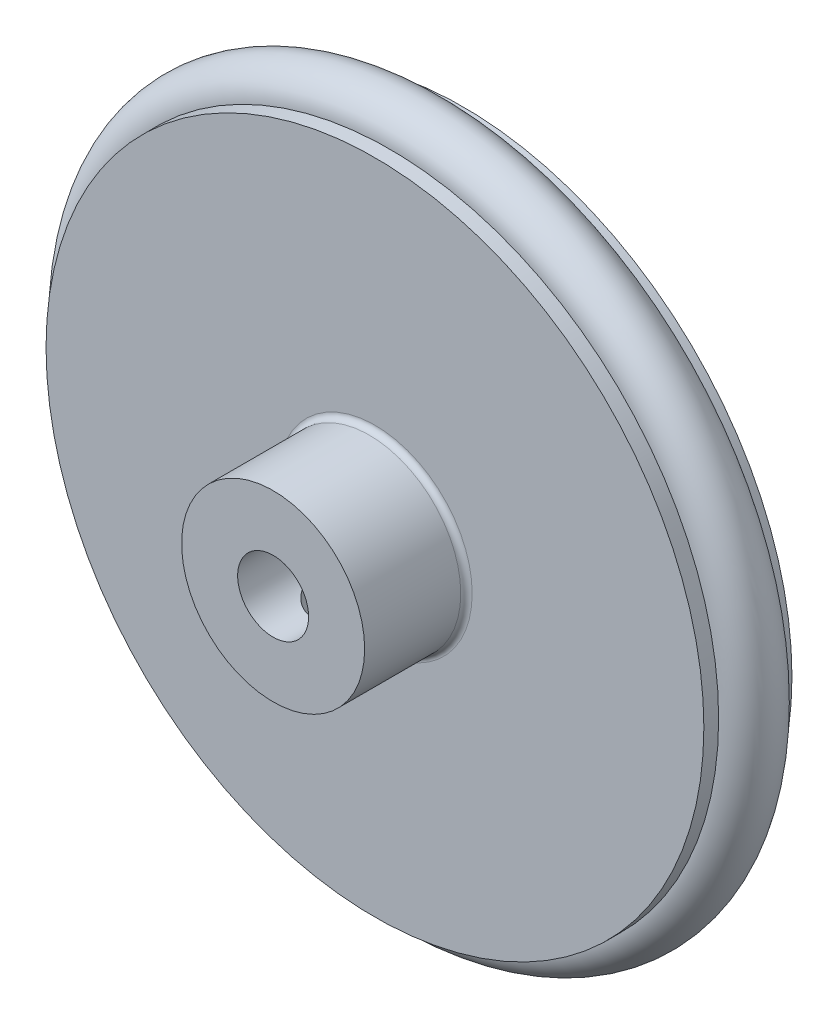
ISO-10303-21;
HEADER;
FILE_DESCRIPTION(('STEP AP214'),'2;1');
FILE_NAME('part.step','',(''),(''),'','','');
FILE_SCHEMA(('AUTOMOTIVE_DESIGN { 1 0 10303 214 1 1 1 1 }'));
ENDSEC;
DATA;
#1=APPLICATION_CONTEXT('core data for automotive mechanical design processes');
#2=APPLICATION_PROTOCOL_DEFINITION('international standard','automotive_design',2000,#1);
#3=PRODUCT_CONTEXT('',#1,'mechanical');
#4=PRODUCT('Part','Part','',(#3));
#5=PRODUCT_RELATED_PRODUCT_CATEGORY('part','',(#4));
#6=PRODUCT_DEFINITION_FORMATION('','',#4);
#7=PRODUCT_DEFINITION_CONTEXT('part definition',#1,'design');
#8=PRODUCT_DEFINITION('design','',#6,#7);
#9=PRODUCT_DEFINITION_SHAPE('','',#8);
#10=(LENGTH_UNIT() NAMED_UNIT(*) SI_UNIT(.MILLI.,.METRE.));
#11=(NAMED_UNIT(*) PLANE_ANGLE_UNIT() SI_UNIT($,.RADIAN.));
#12=(NAMED_UNIT(*) SI_UNIT($,.STERADIAN.) SOLID_ANGLE_UNIT());
#13=UNCERTAINTY_MEASURE_WITH_UNIT(LENGTH_MEASURE(1.E-05),#10,'distance_accuracy_value','');
#14=(GEOMETRIC_REPRESENTATION_CONTEXT(3) GLOBAL_UNCERTAINTY_ASSIGNED_CONTEXT((#13)) GLOBAL_UNIT_ASSIGNED_CONTEXT((#10,
#11,#12)) REPRESENTATION_CONTEXT('',''));
#15=CARTESIAN_POINT('',(0.,0.,0.));
#16=DIRECTION('',(0.,0.,1.));
#17=DIRECTION('',(1.,0.,0.));
#18=AXIS2_PLACEMENT_3D('',#15,#16,#17);
#19=CARTESIAN_POINT('',(0.,0.,0.));
#20=DIRECTION('',(0.,0.,-1.));
#21=DIRECTION('',(-1.,0.,0.));
#22=AXIS2_PLACEMENT_3D('',#19,#20,#21);
#23=TOROIDAL_SURFACE('',#22,28.75,2.56123692555145);
#24=CARTESIAN_POINT('',(28.75,0.,0.));
#25=DIRECTION('',(0.,1.,0.));
#26=DIRECTION('',(0.,0.,1.));
#27=AXIS2_PLACEMENT_3D('',#24,#25,#26);
#28=CIRCLE('',#27,2.56123692555145);
#29=CARTESIAN_POINT('',(31.3112369255514,0.,0.));
#30=VERTEX_POINT('',#29);
#31=EDGE_CURVE('E11',#30,#30,#28,.T.);
#32=CARTESIAN_POINT('',(0.,0.,0.));
#33=DIRECTION('',(0.,0.,-1.));
#34=DIRECTION('',(-1.,0.,0.));
#35=AXIS2_PLACEMENT_3D('',#32,#33,#34);
#36=CIRCLE('',#35,31.3112369255515);
#37=EDGE_CURVE('',#30,#30,#36,.T.);
#38=ORIENTED_EDGE('',*,*,#31,.F.);
#39=ORIENTED_EDGE('',*,*,#31,.T.);
#40=ORIENTED_EDGE('',*,*,#37,.T.);
#41=ORIENTED_EDGE('',*,*,#37,.F.);
#42=EDGE_LOOP('',(#38,#40,#39,#41));
#43=FACE_BOUND('',#42,.T.);
#44=ADVANCED_FACE('F46',(#43),#23,.T.);
#45=CLOSED_SHELL('',(#44));
#46=MANIFOLD_SOLID_BREP('B2',#45);
#47=CARTESIAN_POINT('',(0.,0.,3.85));
#48=DIRECTION('',(0.,0.,-1.));
#49=DIRECTION('',(-1.,0.,0.));
#50=AXIS2_PLACEMENT_3D('',#47,#48,#49);
#51=CYLINDRICAL_SURFACE('',#50,28.75);
#52=CARTESIAN_POINT('',(0.,0.,2.55));
#53=DIRECTION('',(0.,0.,-1.));
#54=DIRECTION('',(-1.,0.,0.));
#55=AXIS2_PLACEMENT_3D('',#52,#53,#54);
#56=CIRCLE('',#55,28.75);
#57=CARTESIAN_POINT('',(28.75,0.,2.55));
#58=VERTEX_POINT('',#57);
#59=EDGE_CURVE('E86',#58,#58,#56,.F.);
#60=ORIENTED_EDGE('',*,*,#59,.T.);
#61=EDGE_LOOP('',(#60));
#62=FACE_BOUND('',#61,.T.);
#63=CARTESIAN_POINT('',(0.,0.,3.85));
#64=DIRECTION('',(0.,0.,1.));
#65=DIRECTION('',(1.,0.,0.));
#66=AXIS2_PLACEMENT_3D('',#63,#64,#65);
#67=CIRCLE('',#66,28.75);
#68=CARTESIAN_POINT('',(28.75,0.,3.85));
#69=VERTEX_POINT('',#68);
#70=EDGE_CURVE('E91',#69,#69,#67,.T.);
#71=ORIENTED_EDGE('',*,*,#70,.F.);
#72=EDGE_LOOP('',(#71));
#73=FACE_BOUND('',#72,.T.);
#74=ADVANCED_FACE('F66',(#62,#73),#51,.T.);
#75=CARTESIAN_POINT('',(0.,0.,3.85));
#76=DIRECTION('',(0.,0.,1.));
#77=DIRECTION('',(1.,0.,0.));
#78=AXIS2_PLACEMENT_3D('',#75,#76,#77);
#79=PLANE('',#78);
#80=CARTESIAN_POINT('',(0.,0.,3.85));
#81=DIRECTION('',(0.,0.,1.));
#82=DIRECTION('',(1.,0.,0.));
#83=AXIS2_PLACEMENT_3D('',#80,#81,#82);
#84=CIRCLE('',#83,8.5);
#85=CARTESIAN_POINT('',(8.5,0.,3.85));
#86=VERTEX_POINT('',#85);
#87=EDGE_CURVE('E44',#86,#86,#84,.F.);
#88=ORIENTED_EDGE('',*,*,#87,.T.);
#89=EDGE_LOOP('',(#88));
#90=FACE_BOUND('',#89,.T.);
#91=ORIENTED_EDGE('',*,*,#70,.T.);
#92=EDGE_LOOP('',(#91));
#93=FACE_BOUND('',#92,.T.);
#94=ADVANCED_FACE('F138',(#90,#93),#79,.T.);
#95=CARTESIAN_POINT('',(0.,0.,0.));
#96=DIRECTION('',(0.,0.,1.));
#97=DIRECTION('',(1.,0.,0.));
#98=AXIS2_PLACEMENT_3D('',#95,#96,#97);
#99=TOROIDAL_SURFACE('',#98,28.75,2.55);
#100=CARTESIAN_POINT('',(28.75,0.,0.));
#101=DIRECTION('',(0.,1.,0.));
#102=DIRECTION('',(0.,0.,1.));
#103=AXIS2_PLACEMENT_3D('',#100,#101,#102);
#104=CIRCLE('',#103,2.55);
#105=CARTESIAN_POINT('',(28.75,0.,-2.55));
#106=VERTEX_POINT('',#105);
#107=EDGE_CURVE('E81',#106,#58,#104,.T.);
#108=ORIENTED_EDGE('',*,*,#107,.F.);
#109=CARTESIAN_POINT('',(0.,0.,-2.55));
#110=DIRECTION('',(0.,0.,1.));
#111=DIRECTION('',(1.,0.,0.));
#112=AXIS2_PLACEMENT_3D('',#109,#110,#111);
#113=CIRCLE('',#112,28.75);
#114=EDGE_CURVE('E84',#106,#106,#113,.F.);
#115=ORIENTED_EDGE('',*,*,#114,.F.);
#116=ORIENTED_EDGE('',*,*,#107,.T.);
#117=ORIENTED_EDGE('',*,*,#59,.F.);
#118=EDGE_LOOP('',(#108,#115,#116,#117));
#119=FACE_BOUND('',#118,.T.);
#120=ADVANCED_FACE('F82',(#119),#99,.F.);
#121=CARTESIAN_POINT('',(0.,0.,-3.85));
#122=DIRECTION('',(0.,0.,1.));
#123=DIRECTION('',(1.,0.,0.));
#124=AXIS2_PLACEMENT_3D('',#121,#122,#123);
#125=PLANE('',#124);
#126=CARTESIAN_POINT('',(0.,0.,-3.85));
#127=DIRECTION('',(0.,0.,1.));
#128=DIRECTION('',(1.,0.,0.));
#129=AXIS2_PLACEMENT_3D('',#126,#127,#128);
#130=CIRCLE('',#129,28.75);
#131=CARTESIAN_POINT('',(28.75,0.,-3.85));
#132=VERTEX_POINT('',#131);
#133=EDGE_CURVE('E87',#132,#132,#130,.T.);
#134=ORIENTED_EDGE('',*,*,#133,.F.);
#135=EDGE_LOOP('',(#134));
#136=FACE_BOUND('',#135,.T.);
#137=ADVANCED_FACE('F137',(#136),#125,.F.);
#138=ORIENTED_EDGE('',*,*,#114,.T.);
#139=EDGE_LOOP('',(#138));
#140=FACE_BOUND('',#139,.T.);
#141=ORIENTED_EDGE('',*,*,#133,.T.);
#142=EDGE_LOOP('',(#141));
#143=FACE_BOUND('',#142,.T.);
#144=ADVANCED_FACE('F133',(#140,#143),#51,.T.);
#145=CARTESIAN_POINT('',(0.,0.,12.75));
#146=DIRECTION('',(0.,0.,-1.));
#147=DIRECTION('',(-1.,0.,0.));
#148=AXIS2_PLACEMENT_3D('',#145,#146,#147);
#149=CYLINDRICAL_SURFACE('',#148,8.);
#150=CARTESIAN_POINT('',(0.,0.,4.35));
#151=DIRECTION('',(0.,0.,1.));
#152=DIRECTION('',(1.,0.,0.));
#153=AXIS2_PLACEMENT_3D('',#150,#151,#152);
#154=CIRCLE('',#153,8.);
#155=CARTESIAN_POINT('',(8.,0.,4.35));
#156=VERTEX_POINT('',#155);
#157=EDGE_CURVE('E74',#156,#156,#154,.T.);
#158=ORIENTED_EDGE('',*,*,#157,.T.);
#159=EDGE_LOOP('',(#158));
#160=FACE_BOUND('',#159,.T.);
#161=CARTESIAN_POINT('',(0.,-8.,9.5));
#162=CARTESIAN_POINT('',(0.110501451559641,-7.9999981315735,9.49999689901579));
#163=CARTESIAN_POINT('',(0.221037543774351,-7.99768770842435,9.49081126563495));
#164=CARTESIAN_POINT('',(0.438941765027377,-7.98869485106526,9.45436646492399));
#165=CARTESIAN_POINT('',(0.546308062494319,-7.98200993893301,9.42709705394953));
#166=CARTESIAN_POINT('',(0.754694496243435,-7.96500835109376,9.35541432871722));
#167=CARTESIAN_POINT('',(0.855722084573336,-7.95469603789411,9.31102160171297));
#168=CARTESIAN_POINT('',(1.04889617587257,-7.93153791743495,9.20642481327354));
#169=CARTESIAN_POINT('',(1.14104237913168,-7.91869202472209,9.14622021850805));
#170=CARTESIAN_POINT('',(1.31573590306789,-7.89156551455591,9.01039894712776));
#171=CARTESIAN_POINT('',(1.39807425341474,-7.87726276197502,8.93451790005459));
#172=CARTESIAN_POINT('',(1.54899856960443,-7.84898160157248,8.77006372678795));
#173=CARTESIAN_POINT('',(1.61758298259892,-7.83500323053157,8.68148916940408));
#174=CARTESIAN_POINT('',(1.74003539039863,-7.80873034264225,8.49253969768401));
#175=CARTESIAN_POINT('',(1.79366962123352,-7.79646392619748,8.39200902558836));
#176=CARTESIAN_POINT('',(1.88319587806766,-7.77532659757355,8.18300211778662));
#177=CARTESIAN_POINT('',(1.91909074058685,-7.76645514259225,8.07452715555731));
#178=CARTESIAN_POINT('',(1.97140644907302,-7.7533396892843,7.85500866906446));
#179=CARTESIAN_POINT('',(1.98820302444274,-7.74900654662681,7.74406013861601));
#180=CARTESIAN_POINT('',(2.00301570008854,-7.74519149946122,7.52084190800087));
#181=CARTESIAN_POINT('',(2.00103485575748,-7.74570880570571,7.40857242574382));
#182=CARTESIAN_POINT('',(1.97864869951961,-7.75145607355756,7.1887789230062));
#183=CARTESIAN_POINT('',(1.95869112025418,-7.75657150676391,7.08120583804623));
#184=CARTESIAN_POINT('',(1.90163224920399,-7.77075612894758,6.87098526545192));
#185=CARTESIAN_POINT('',(1.86452973609252,-7.77982559958985,6.76833812929477));
#186=CARTESIAN_POINT('',(1.77385263724958,-7.80100151874212,6.56968264499716));
#187=CARTESIAN_POINT('',(1.72011555631056,-7.81313769959755,6.47375177094724));
#188=CARTESIAN_POINT('',(1.59780836801993,-7.83906281127988,6.29210838699091));
#189=CARTESIAN_POINT('',(1.52923566507845,-7.85285203112837,6.20639766924367));
#190=CARTESIAN_POINT('',(1.37688456624163,-7.88101174053188,6.04506184574079));
#191=CARTESIAN_POINT('',(1.29272834422115,-7.89538759304001,5.96979401325153));
#192=CARTESIAN_POINT('',(1.11281589000493,-7.92274620771675,5.8343716767148));
#193=CARTESIAN_POINT('',(1.01705930361059,-7.93572892732543,5.77421763431525));
#194=CARTESIAN_POINT('',(0.816154518241855,-7.9589030945892,5.67059921836749));
#195=CARTESIAN_POINT('',(0.710975190944831,-7.96908480170303,5.62719287966076));
#196=CARTESIAN_POINT('',(0.49450134419051,-7.98543889321888,5.55877692572057));
#197=CARTESIAN_POINT('',(0.383207998867312,-7.99161204452374,5.53376379144248));
#198=CARTESIAN_POINT('',(0.160719960520035,-7.999139990285,5.50338991258822));
#199=CARTESIAN_POINT('',(0.0495956266509452,-8.00061404677705,5.4975426318996));
#200=CARTESIAN_POINT('',(-0.172043833068678,-7.99891739752601,5.50433200274065));
#201=CARTESIAN_POINT('',(-0.282559012859461,-7.99574710989128,5.51696699039884));
#202=CARTESIAN_POINT('',(-0.498152358368656,-7.98519441503143,5.55996121118851));
#203=CARTESIAN_POINT('',(-0.603286825291673,-7.97787512247748,5.59005501796932));
#204=CARTESIAN_POINT('',(-0.807009723270016,-7.95984942178845,5.66680944537126));
#205=CARTESIAN_POINT('',(-0.905597492043513,-7.94914267159856,5.71347173908423));
#206=CARTESIAN_POINT('',(-1.0953641792398,-7.92524410568414,5.82298150516631));
#207=CARTESIAN_POINT('',(-1.18638058911444,-7.91201156489243,5.88610148319569));
#208=CARTESIAN_POINT('',(-1.35670215152433,-7.88459345583226,6.02638654506263));
#209=CARTESIAN_POINT('',(-1.43600527863068,-7.87040772335606,6.10355405282254));
#210=CARTESIAN_POINT('',(-1.58265409076364,-7.84225275947695,6.27200261445929));
#211=CARTESIAN_POINT('',(-1.64965849016271,-7.82829738916375,6.36358360400323));
#212=CARTESIAN_POINT('',(-1.7673476786836,-7.80257171169652,6.55697684595429));
#213=CARTESIAN_POINT('',(-1.81803319221058,-7.79080130756035,6.65878864394634));
#214=CARTESIAN_POINT('',(-1.90126856081239,-7.77090792979553,6.86920762988411));
#215=CARTESIAN_POINT('',(-1.93392586220542,-7.76276340389207,6.97777017112535));
#216=CARTESIAN_POINT('',(-1.98046087993837,-7.75102325453578,7.19907951718548));
#217=CARTESIAN_POINT('',(-1.99434270330488,-7.74742663626581,7.31182540137666));
#218=CARTESIAN_POINT('',(-2.00271812044533,-7.74526534938609,7.53482803180694));
#219=CARTESIAN_POINT('',(-1.99775719704016,-7.74655910304352,7.64506324683298));
#220=CARTESIAN_POINT('',(-1.96983637108382,-7.7537054534379,7.86307185155731));
#221=CARTESIAN_POINT('',(-1.94687683024903,-7.75955795855809,7.97084529068487));
#222=CARTESIAN_POINT('',(-1.88390842592373,-7.77508347576963,8.18027794542055));
#223=CARTESIAN_POINT('',(-1.84400187290717,-7.78473353648412,8.28196974032028));
#224=CARTESIAN_POINT('',(-1.74835321814009,-7.80677007633105,8.47728717695159));
#225=CARTESIAN_POINT('',(-1.69260892004558,-7.81915693494364,8.57091169758256));
#226=CARTESIAN_POINT('',(-1.56515699818285,-7.8456751235135,8.75007283866936));
#227=CARTESIAN_POINT('',(-1.493070883883,-7.85984353109009,8.83533476456528));
#228=CARTESIAN_POINT('',(-1.33571916158631,-7.88810702995048,8.99272939306054));
#229=CARTESIAN_POINT('',(-1.25045042834819,-7.90220210302746,9.06485897348396));
#230=CARTESIAN_POINT('',(-1.06729011560345,-7.92903540863551,9.19521507808614));
#231=CARTESIAN_POINT('',(-0.969197896421848,-7.94174444487824,9.25316615156211));
#232=CARTESIAN_POINT('',(-0.764354746013967,-7.96406566633491,9.35166328392071));
#233=CARTESIAN_POINT('',(-0.657610084582319,-7.97368006933042,9.39222181419805));
#234=CARTESIAN_POINT('',(-0.459213670991295,-7.98730746087389,9.44876244043954));
#235=CARTESIAN_POINT('',(-0.368506894544092,-7.9920344673692,9.46793499073791));
#236=CARTESIAN_POINT('',(-0.185208095381711,-7.99838140309264,9.49355459149592));
#237=CARTESIAN_POINT('',(-0.0926162149901552,-8.00000156601192,9.50000259907373));
#238=CARTESIAN_POINT('',(0.,-8.,9.5));
#239=B_SPLINE_CURVE_WITH_KNOTS('',3,(#161,#162,#163,#164,#165,#166,#167,#168,#169,#170,#171,
#172,#173,#174,#175,#176,#177,#178,#179,#180,#181,#182,#183,#184,#185,#186,#187,#188,#189,#190,
#191,#192,#193,#194,#195,#196,#197,#198,#199,#200,#201,#202,#203,#204,#205,#206,#207,#208,#209,
#210,#211,#212,#213,#214,#215,#216,#217,#218,#219,#220,#221,#222,#223,#224,#225,#226,#227,#228,
#229,#230,#231,#232,#233,#234,#235,#236,#237,#238),.UNSPECIFIED.,.T.,.F.,(4,2,2,2,2,2,2,2,2,2,2,
2,2,2,2,2,2,2,2,2,2,2,2,2,2,2,2,2,2,2,2,2,2,2,2,2,2,2,4),(0.,0.331164949962519,
0.662517650351866,0.993473203048141,1.32443992022577,1.66152580582852,1.99864972773416,
2.34078196727742,2.68285948225824,3.01808393468093,3.3532538415469,3.68029996013785,
4.00736937959146,4.337740371696,4.66816921119311,5.00802001296453,5.34788119415424,
5.6889097201658,6.02987298255951,6.36211078603463,6.69431868154752,7.02160366023144,
7.34892169767482,7.68204783424897,8.01523150681786,8.35659345610396,8.69794025003772,
9.03723006156476,9.37644564340971,9.70591707202578,10.0353818794581,10.3628853408369,
10.6904342418696,11.0265276855097,11.3627009303165,11.7049624733721,12.0469781843289,
12.3245632392729,12.6021274139515),.UNSPECIFIED.);
#240=CARTESIAN_POINT('',(0.,-8.,9.5));
#241=VERTEX_POINT('',#240);
#242=EDGE_CURVE('E109',#241,#241,#239,.T.);
#243=ORIENTED_EDGE('',*,*,#242,.T.);
#244=EDGE_LOOP('',(#243));
#245=FACE_BOUND('',#244,.T.);
#246=CARTESIAN_POINT('',(0.,0.,12.75));
#247=DIRECTION('',(0.,0.,1.));
#248=DIRECTION('',(1.,0.,0.));
#249=AXIS2_PLACEMENT_3D('',#246,#247,#248);
#250=CIRCLE('',#249,8.);
#251=CARTESIAN_POINT('',(8.,0.,12.75));
#252=VERTEX_POINT('',#251);
#253=EDGE_CURVE('E88',#252,#252,#250,.T.);
#254=ORIENTED_EDGE('',*,*,#253,.F.);
#255=EDGE_LOOP('',(#254));
#256=FACE_BOUND('',#255,.T.);
#257=ADVANCED_FACE('F128',(#160,#245,#256),#149,.T.);
#258=CARTESIAN_POINT('',(0.,0.,12.75));
#259=DIRECTION('',(0.,0.,1.));
#260=DIRECTION('',(1.,0.,0.));
#261=AXIS2_PLACEMENT_3D('',#258,#259,#260);
#262=PLANE('',#261);
#263=CARTESIAN_POINT('',(0.,0.,12.75));
#264=DIRECTION('',(0.,0.,1.));
#265=DIRECTION('',(1.,0.,0.));
#266=AXIS2_PLACEMENT_3D('',#263,#264,#265);
#267=CIRCLE('',#266,3.1);
#268=CARTESIAN_POINT('',(3.1,0.,12.75));
#269=VERTEX_POINT('',#268);
#270=EDGE_CURVE('E127',#269,#269,#267,.T.);
#271=ORIENTED_EDGE('',*,*,#270,.F.);
#272=EDGE_LOOP('',(#271));
#273=FACE_BOUND('',#272,.T.);
#274=ORIENTED_EDGE('',*,*,#253,.T.);
#275=EDGE_LOOP('',(#274));
#276=FACE_BOUND('',#275,.T.);
#277=ADVANCED_FACE('F132',(#273,#276),#262,.T.);
#278=CARTESIAN_POINT('',(0.,0.,-12.6181240867132));
#279=DIRECTION('',(0.,0.,1.));
#280=DIRECTION('',(1.,0.,0.));
#281=AXIS2_PLACEMENT_3D('',#278,#279,#280);
#282=CYLINDRICAL_SURFACE('',#281,3.1);
#283=CARTESIAN_POINT('',(0.,-3.1,9.5));
#284=CARTESIAN_POINT('',(-0.101091385039777,-3.09999460939274,9.49999423985456));
#285=CARTESIAN_POINT('',(-0.202236134564494,-3.09500777365122,9.49228861003426));
#286=CARTESIAN_POINT('',(-0.40134422219677,-3.07554251080367,9.46191052513201));
#287=CARTESIAN_POINT('',(-0.499304337672782,-3.0610547651011,9.43922337585951));
#288=CARTESIAN_POINT('',(-0.688847609969658,-3.02403316266577,9.38023929755381));
#289=CARTESIAN_POINT('',(-0.780458562332545,-3.00153742435718,9.34400680467486));
#290=CARTESIAN_POINT('',(-0.955964244967446,-2.95033924070804,9.25944096599089));
#291=CARTESIAN_POINT('',(-1.03985843062382,-2.9216363577727,9.21110676699504));
#292=CARTESIAN_POINT('',(-1.20534975085783,-2.85755815418126,9.09934687867213));
#293=CARTESIAN_POINT('',(-1.28618869122808,-2.82182799524603,9.0350061395549));
#294=CARTESIAN_POINT('',(-1.43665631544782,-2.74828108070154,8.89520120954714));
#295=CARTESIAN_POINT('',(-1.50626924383573,-2.71046149080006,8.81972166508535));
#296=CARTESIAN_POINT('',(-1.64268679943019,-2.63034253686168,8.64691651791072));
#297=CARTESIAN_POINT('',(-1.70759476074744,-2.58819607847858,8.54801033709484));
#298=CARTESIAN_POINT('',(-1.81972592440112,-2.51062817225813,8.33825819113032));
#299=CARTESIAN_POINT('',(-1.86697956402236,-2.47519520238284,8.2274332037925));
#300=CARTESIAN_POINT('',(-1.93115046035712,-2.42525032881529,8.02768249145855));
#301=CARTESIAN_POINT('',(-1.95283049983355,-2.40766682164749,7.94106125555081));
#302=CARTESIAN_POINT('',(-1.98446592184547,-2.38166474413427,7.76441515405156));
#303=CARTESIAN_POINT('',(-1.99443957013961,-2.37323189735386,7.67439581776609));
#304=CARTESIAN_POINT('',(-2.00204983941226,-2.36681793758445,7.49315258210891));
#305=CARTESIAN_POINT('',(-1.99964615392167,-2.36887097141953,7.4019257134594));
#306=CARTESIAN_POINT('',(-1.98258006769263,-2.38316799120796,7.2214121827045));
#307=CARTESIAN_POINT('',(-1.96790747526994,-2.39542044970509,7.13212719699272));
#308=CARTESIAN_POINT('',(-1.92786567346179,-2.42774793365928,6.9607019055138));
#309=CARTESIAN_POINT('',(-1.9028579256027,-2.44755702424853,6.87842389978763));
#310=CARTESIAN_POINT('',(-1.84321796757953,-2.49277853296268,6.71910848586362));
#311=CARTESIAN_POINT('',(-1.80858257660194,-2.51819280237145,6.64207282013664));
#312=CARTESIAN_POINT('',(-1.72290696910724,-2.5777531470504,6.47940367147485));
#313=CARTESIAN_POINT('',(-1.66998346799092,-2.61263498659573,6.39503299514242));
#314=CARTESIAN_POINT('',(-1.55262072653794,-2.68404531595956,6.2354053931168));
#315=CARTESIAN_POINT('',(-1.48816769918918,-2.72057573761244,6.16015956168707));
#316=CARTESIAN_POINT('',(-1.33531850150805,-2.79921977867378,6.00641965469216));
#317=CARTESIAN_POINT('',(-1.2446991971314,-2.84108811643832,5.92998603795691));
#318=CARTESIAN_POINT('',(-1.04963410942446,-2.91877600894092,5.79342507092218));
#319=CARTESIAN_POINT('',(-0.945202988602563,-2.95460188779143,5.73328063171092));
#320=CARTESIAN_POINT('',(-0.746639365899209,-3.01014273026213,5.64204748666379));
#321=CARTESIAN_POINT('',(-0.65456737995395,-3.03164347825907,5.6075627187463));
#322=CARTESIAN_POINT('',(-0.464930213104867,-3.06644845105128,5.55229077747468));
#323=CARTESIAN_POINT('',(-0.367369568656605,-3.07975933933833,5.53149246748689));
#324=CARTESIAN_POINT('',(-0.169045410576032,-3.0969921575555,5.50463832866688));
#325=CARTESIAN_POINT('',(-0.0682718516736113,-3.10088094883133,5.49863453267088));
#326=CARTESIAN_POINT('',(0.132930127327373,-3.0987818893615,5.50188808806102));
#327=CARTESIAN_POINT('',(0.233358534619953,-3.09279367603535,5.51114599969775));
#328=CARTESIAN_POINT('',(0.425119290519885,-3.0721423509695,5.54342154508947));
#329=CARTESIAN_POINT('',(0.51664537144639,-3.05798682310753,5.56563483512585));
#330=CARTESIAN_POINT('',(0.694421792387248,-3.02258192723568,5.62210647387215));
#331=CARTESIAN_POINT('',(0.780671246170739,-3.00133137143629,5.65636683945258));
#332=CARTESIAN_POINT('',(0.952313130749649,-2.95155061853353,5.73852436888356));
#333=CARTESIAN_POINT('',(1.03719832856589,-2.92260695610669,5.78722473299525));
#334=CARTESIAN_POINT('',(1.19797699917457,-2.86047105425269,5.89554882406114));
#335=CARTESIAN_POINT('',(1.27386369806246,-2.82727565280704,5.95518069515739));
#336=CARTESIAN_POINT('',(1.42679573254823,-2.75363680286679,6.09411453626771));
#337=CARTESIAN_POINT('',(1.502217991591,-2.71286465557268,6.17503157595802));
#338=CARTESIAN_POINT('',(1.63901758369639,-2.63247341235496,6.34855184705935));
#339=CARTESIAN_POINT('',(1.70039095540679,-2.59285464439052,6.44115836314992));
#340=CARTESIAN_POINT('',(1.80081056775826,-2.5239466231388,6.62446981638804));
#341=CARTESIAN_POINT('',(1.84170928019883,-2.49398430191481,6.71390042775378));
#342=CARTESIAN_POINT('',(1.91037132253394,-2.44179234650511,6.8997766615712));
#343=CARTESIAN_POINT('',(1.93815244113827,-2.41955225114483,6.99621257806556));
#344=CARTESIAN_POINT('',(1.97925302886152,-2.38606269457456,7.19512500607156));
#345=CARTESIAN_POINT('',(1.99242553477726,-2.37492503520893,7.29765216173333));
#346=CARTESIAN_POINT('',(2.00265608987801,-2.36631138405995,7.50404792910151));
#347=CARTESIAN_POINT('',(1.99972843393145,-2.36882327321338,7.60791526916267));
#348=CARTESIAN_POINT('',(1.97974948336216,-2.385519162785,7.79704235785586));
#349=CARTESIAN_POINT('',(1.96492208911016,-2.39786312632663,7.88272249216542));
#350=CARTESIAN_POINT('',(1.92478575684782,-2.43019785844483,8.05010808712704));
#351=CARTESIAN_POINT('',(1.8994662269818,-2.45019635274102,8.13180943777216));
#352=CARTESIAN_POINT('',(1.8289643349275,-2.50348562062322,8.31720982840996));
#353=CARTESIAN_POINT('',(1.77994565236697,-2.53898245001553,8.41881180681012));
#354=CARTESIAN_POINT('',(1.66665742988777,-2.61474699558477,8.61119491391551));
#355=CARTESIAN_POINT('',(1.60236450988041,-2.65502197783671,8.70195913016394));
#356=CARTESIAN_POINT('',(1.45888519845899,-2.73652246794838,8.87267718655171));
#357=CARTESIAN_POINT('',(1.37951440481604,-2.77775351345464,8.95247350407429));
#358=CARTESIAN_POINT('',(1.20753038667599,-2.85671179204102,9.09829677390185));
#359=CARTESIAN_POINT('',(1.11492957876487,-2.89444225631806,9.16433649573719));
#360=CARTESIAN_POINT('',(0.930076713789365,-2.95860078482454,9.27341698597728));
#361=CARTESIAN_POINT('',(0.839194900302701,-2.98584930398292,9.318291150779));
#362=CARTESIAN_POINT('',(0.650002847052295,-3.03264637260129,9.39415954682018));
#363=CARTESIAN_POINT('',(0.551704291854859,-3.05220674429459,9.42517509888306));
#364=CARTESIAN_POINT('',(0.377584832422472,-3.07781554283967,9.46548062779998));
#365=CARTESIAN_POINT('',(0.30291009649643,-3.08609090810034,9.47838335273191));
#366=CARTESIAN_POINT('',(0.15216703635602,-3.09718531112089,9.49564543467788));
#367=CARTESIAN_POINT('',(0.0760986380390963,-3.10000405789149,9.50000433606902));
#368=CARTESIAN_POINT('',(0.,-3.1,9.5));
#369=B_SPLINE_CURVE_WITH_KNOTS('',3,(#283,#284,#285,#286,#287,#288,#289,#290,#291,#292,#293,
#294,#295,#296,#297,#298,#299,#300,#301,#302,#303,#304,#305,#306,#307,#308,#309,#310,#311,#312,
#313,#314,#315,#316,#317,#318,#319,#320,#321,#322,#323,#324,#325,#326,#327,#328,#329,#330,#331,
#332,#333,#334,#335,#336,#337,#338,#339,#340,#341,#342,#343,#344,#345,#346,#347,#348,#349,#350,
#351,#352,#353,#354,#355,#356,#357,#358,#359,#360,#361,#362,#363,#364,#365,#366,#367,#368),
.UNSPECIFIED.,.T.,.F.,(4,2,2,2,2,2,2,2,2,2,2,2,2,2,2,2,2,2,2,2,2,2,2,2,2,2,2,2,2,2,2,2,2,2,2,2,
2,2,2,2,2,2,4),(0.,0.302966311138187,0.606230220275506,0.908069468488516,1.20993000287647,
1.53665065809857,1.86382594121082,2.23880818267474,2.61314091205647,2.88505518621458,
3.15654461969954,3.42891870954099,3.70151928342565,3.96529957222992,4.22916711345738,
4.54461288083483,4.86043841114649,5.23578572642889,5.61073772744286,5.91138256881843,
6.21178247281048,6.51323739565213,6.814703385018,7.09919018653744,7.38372463832978,
7.68871147259943,7.99392645710977,8.34616896663427,8.69851067565524,9.00574516973998,
9.31256181935081,9.62243782101927,9.9320387371862,10.1943851218243,10.4569969939451,
10.8099170659531,11.1633808690887,11.521483908107,11.8792530427354,12.1928227029758,
12.5059082759399,12.7339602929413,12.9620244711131),.UNSPECIFIED.);
#370=CARTESIAN_POINT('',(0.,-3.1,9.5));
#371=VERTEX_POINT('',#370);
#372=EDGE_CURVE('E102',#371,#371,#369,.T.);
#373=ORIENTED_EDGE('',*,*,#372,.T.);
#374=EDGE_LOOP('',(#373));
#375=FACE_BOUND('',#374,.T.);
#376=CARTESIAN_POINT('',(0.,0.,-2.85));
#377=DIRECTION('',(0.,0.,1.));
#378=DIRECTION('',(1.,0.,0.));
#379=AXIS2_PLACEMENT_3D('',#376,#377,#378);
#380=CIRCLE('',#379,3.1);
#381=CARTESIAN_POINT('',(3.1,0.,-2.85));
#382=VERTEX_POINT('',#381);
#383=EDGE_CURVE('E94',#382,#382,#380,.F.);
#384=ORIENTED_EDGE('',*,*,#383,.T.);
#385=EDGE_LOOP('',(#384));
#386=FACE_BOUND('',#385,.T.);
#387=ORIENTED_EDGE('',*,*,#270,.T.);
#388=EDGE_LOOP('',(#387));
#389=FACE_BOUND('',#388,.T.);
#390=ADVANCED_FACE('F110',(#375,#386,#389),#282,.F.);
#391=CARTESIAN_POINT('',(0.,0.,-2.85));
#392=DIRECTION('',(0.,0.,1.));
#393=DIRECTION('',(1.,0.,0.));
#394=AXIS2_PLACEMENT_3D('',#391,#392,#393);
#395=PLANE('',#394);
#396=ORIENTED_EDGE('',*,*,#383,.F.);
#397=EDGE_LOOP('',(#396));
#398=FACE_BOUND('',#397,.T.);
#399=ADVANCED_FACE('F117',(#398),#395,.T.);
#400=CARTESIAN_POINT('',(0.,-31.3112369255515,7.5));
#401=DIRECTION('',(0.,1.,0.));
#402=DIRECTION('',(0.,0.,1.));
#403=AXIS2_PLACEMENT_3D('',#400,#401,#402);
#404=CYLINDRICAL_SURFACE('',#403,2.);
#405=ORIENTED_EDGE('',*,*,#372,.F.);
#406=EDGE_LOOP('',(#405));
#407=FACE_BOUND('',#406,.T.);
#408=ORIENTED_EDGE('',*,*,#242,.F.);
#409=EDGE_LOOP('',(#408));
#410=FACE_BOUND('',#409,.T.);
#411=ADVANCED_FACE('F114',(#407,#410),#404,.F.);
#412=CARTESIAN_POINT('',(0.,0.,4.35));
#413=DIRECTION('',(0.,0.,1.));
#414=DIRECTION('',(1.,0.,0.));
#415=AXIS2_PLACEMENT_3D('',#412,#413,#414);
#416=TOROIDAL_SURFACE('',#415,8.5,0.5);
#417=ORIENTED_EDGE('',*,*,#87,.F.);
#418=EDGE_LOOP('',(#417));
#419=FACE_BOUND('',#418,.T.);
#420=ORIENTED_EDGE('',*,*,#157,.F.);
#421=EDGE_LOOP('',(#420));
#422=FACE_BOUND('',#421,.T.);
#423=ADVANCED_FACE('F68',(#419,#422),#416,.F.);
#424=CLOSED_SHELL('',(#74,#94,#120,#137,#144,#257,#277,#390,#399,#411,#423));
#425=MANIFOLD_SOLID_BREP('B6',#424);
#426=ADVANCED_BREP_SHAPE_REPRESENTATION('',(#18,#46,#425),#14);
#427=SHAPE_DEFINITION_REPRESENTATION(#9,#426);
ENDSEC;
END-ISO-10303-21;
